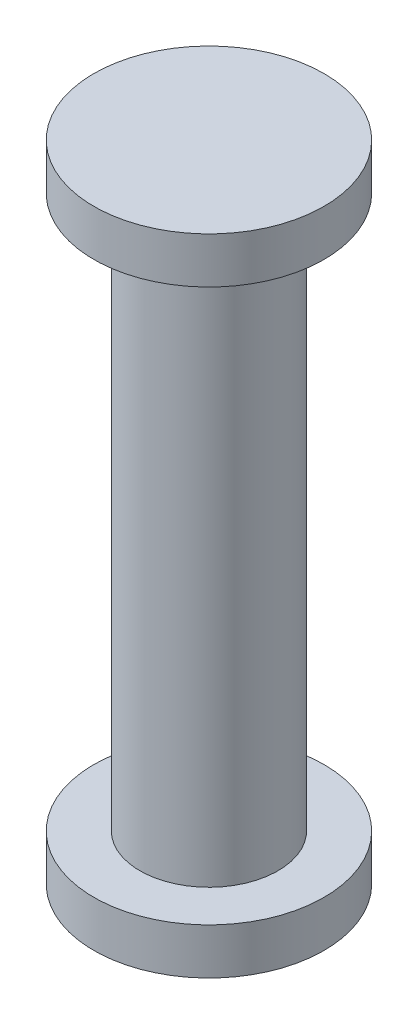
ISO-10303-21;
HEADER;
FILE_DESCRIPTION(('STEP AP214'),'2;1');
FILE_NAME('part.step','',(''),(''),'','','');
FILE_SCHEMA(('AUTOMOTIVE_DESIGN { 1 0 10303 214 1 1 1 1 }'));
ENDSEC;
DATA;
#1=APPLICATION_CONTEXT('core data for automotive mechanical design processes');
#2=APPLICATION_PROTOCOL_DEFINITION('international standard','automotive_design',2000,#1);
#3=PRODUCT_CONTEXT('',#1,'mechanical');
#4=PRODUCT('Part','Part','',(#3));
#5=PRODUCT_RELATED_PRODUCT_CATEGORY('part','',(#4));
#6=PRODUCT_DEFINITION_FORMATION('','',#4);
#7=PRODUCT_DEFINITION_CONTEXT('part definition',#1,'design');
#8=PRODUCT_DEFINITION('design','',#6,#7);
#9=PRODUCT_DEFINITION_SHAPE('','',#8);
#10=(LENGTH_UNIT() NAMED_UNIT(*) SI_UNIT(.MILLI.,.METRE.));
#11=(NAMED_UNIT(*) PLANE_ANGLE_UNIT() SI_UNIT($,.RADIAN.));
#12=(NAMED_UNIT(*) SI_UNIT($,.STERADIAN.) SOLID_ANGLE_UNIT());
#13=UNCERTAINTY_MEASURE_WITH_UNIT(LENGTH_MEASURE(1.E-05),#10,'distance_accuracy_value','');
#14=(GEOMETRIC_REPRESENTATION_CONTEXT(3) GLOBAL_UNCERTAINTY_ASSIGNED_CONTEXT((#13)) GLOBAL_UNIT_ASSIGNED_CONTEXT((#10,
#11,#12)) REPRESENTATION_CONTEXT('',''));
#15=CARTESIAN_POINT('',(0.,0.,0.));
#16=DIRECTION('',(0.,0.,1.));
#17=DIRECTION('',(1.,0.,0.));
#18=AXIS2_PLACEMENT_3D('',#15,#16,#17);
#19=CARTESIAN_POINT('',(3.78332402163125,-4.38970454977032,0.));
#20=DIRECTION('',(0.,1.,0.));
#21=DIRECTION('',(0.,0.,1.));
#22=AXIS2_PLACEMENT_3D('',#19,#20,#21);
#23=PLANE('',#22);
#24=CARTESIAN_POINT('',(6.28332402163125,-4.38970454977032,0.));
#25=DIRECTION('',(0.,-1.,0.));
#26=DIRECTION('',(0.,0.,-1.));
#27=AXIS2_PLACEMENT_3D('',#24,#25,#26);
#28=CIRCLE('',#27,2.5);
#29=CARTESIAN_POINT('',(6.28332402163125,-4.38970454977032,-2.5));
#30=VERTEX_POINT('',#29);
#31=EDGE_CURVE('E64',#30,#30,#28,.T.);
#32=ORIENTED_EDGE('',*,*,#31,.T.);
#33=EDGE_LOOP('',(#32));
#34=FACE_BOUND('',#33,.T.);
#35=ADVANCED_FACE('F37',(#34),#23,.F.);
#36=CARTESIAN_POINT('',(6.28332402163125,9.61029545022968,0.));
#37=DIRECTION('',(0.,-1.,0.));
#38=DIRECTION('',(0.,0.,-1.));
#39=AXIS2_PLACEMENT_3D('',#36,#37,#38);
#40=PLANE('',#39);
#41=CARTESIAN_POINT('',(6.28332402163125,9.61029545022968,0.));
#42=DIRECTION('',(0.,-1.,0.));
#43=DIRECTION('',(0.,0.,-1.));
#44=AXIS2_PLACEMENT_3D('',#41,#42,#43);
#45=CIRCLE('',#44,2.5);
#46=CARTESIAN_POINT('',(6.28332402163125,9.61029545022968,-2.5));
#47=VERTEX_POINT('',#46);
#48=EDGE_CURVE('E10',#47,#47,#45,.T.);
#49=ORIENTED_EDGE('',*,*,#48,.F.);
#50=EDGE_LOOP('',(#49));
#51=FACE_BOUND('',#50,.T.);
#52=ADVANCED_FACE('F95',(#51),#40,.F.);
#53=CARTESIAN_POINT('',(6.28332402163125,-4.38970454977032,0.));
#54=DIRECTION('',(0.,-1.,0.));
#55=DIRECTION('',(0.,0.,-1.));
#56=AXIS2_PLACEMENT_3D('',#53,#54,#55);
#57=CYLINDRICAL_SURFACE('',#56,2.5);
#58=CARTESIAN_POINT('',(6.28332402163125,8.61029545022968,0.));
#59=DIRECTION('',(0.,-1.,0.));
#60=DIRECTION('',(0.,0.,-1.));
#61=AXIS2_PLACEMENT_3D('',#58,#59,#60);
#62=CIRCLE('',#61,2.5);
#63=CARTESIAN_POINT('',(6.28332402163125,8.61029545022968,-2.5));
#64=VERTEX_POINT('',#63);
#65=EDGE_CURVE('E44',#64,#64,#62,.T.);
#66=ORIENTED_EDGE('',*,*,#65,.F.);
#67=EDGE_LOOP('',(#66));
#68=FACE_BOUND('',#67,.T.);
#69=ORIENTED_EDGE('',*,*,#48,.T.);
#70=EDGE_LOOP('',(#69));
#71=FACE_BOUND('',#70,.T.);
#72=ADVANCED_FACE('F90',(#68,#71),#57,.T.);
#73=CARTESIAN_POINT('',(3.78332402163125,8.61029545022968,0.));
#74=DIRECTION('',(0.,1.,0.));
#75=DIRECTION('',(0.,0.,1.));
#76=AXIS2_PLACEMENT_3D('',#73,#74,#75);
#77=PLANE('',#76);
#78=CARTESIAN_POINT('',(6.28332402163125,8.61029545022968,0.));
#79=DIRECTION('',(0.,-1.,0.));
#80=DIRECTION('',(0.,0.,-1.));
#81=AXIS2_PLACEMENT_3D('',#78,#79,#80);
#82=CIRCLE('',#81,1.5);
#83=CARTESIAN_POINT('',(6.28332402163125,8.61029545022968,-1.5));
#84=VERTEX_POINT('',#83);
#85=EDGE_CURVE('E49',#84,#84,#82,.T.);
#86=ORIENTED_EDGE('',*,*,#85,.F.);
#87=EDGE_LOOP('',(#86));
#88=FACE_BOUND('',#87,.T.);
#89=ORIENTED_EDGE('',*,*,#65,.T.);
#90=EDGE_LOOP('',(#89));
#91=FACE_BOUND('',#90,.T.);
#92=ADVANCED_FACE('F85',(#88,#91),#77,.F.);
#93=CARTESIAN_POINT('',(6.28332402163125,-4.38970454977032,0.));
#94=DIRECTION('',(0.,-1.,0.));
#95=DIRECTION('',(0.,0.,-1.));
#96=AXIS2_PLACEMENT_3D('',#93,#94,#95);
#97=CYLINDRICAL_SURFACE('',#96,1.5);
#98=CARTESIAN_POINT('',(6.28332402163125,-3.38970454977032,0.));
#99=DIRECTION('',(0.,-1.,0.));
#100=DIRECTION('',(0.,0.,-1.));
#101=AXIS2_PLACEMENT_3D('',#98,#99,#100);
#102=CIRCLE('',#101,1.5);
#103=CARTESIAN_POINT('',(6.28332402163125,-3.38970454977032,-1.5));
#104=VERTEX_POINT('',#103);
#105=EDGE_CURVE('E54',#104,#104,#102,.T.);
#106=ORIENTED_EDGE('',*,*,#105,.F.);
#107=EDGE_LOOP('',(#106));
#108=FACE_BOUND('',#107,.T.);
#109=ORIENTED_EDGE('',*,*,#85,.T.);
#110=EDGE_LOOP('',(#109));
#111=FACE_BOUND('',#110,.T.);
#112=ADVANCED_FACE('F79',(#108,#111),#97,.T.);
#113=CARTESIAN_POINT('',(4.78332402163125,-3.38970454977032,0.));
#114=DIRECTION('',(0.,-1.,0.));
#115=DIRECTION('',(0.,0.,-1.));
#116=AXIS2_PLACEMENT_3D('',#113,#114,#115);
#117=PLANE('',#116);
#118=CARTESIAN_POINT('',(6.28332402163125,-3.38970454977032,0.));
#119=DIRECTION('',(0.,-1.,0.));
#120=DIRECTION('',(0.,0.,-1.));
#121=AXIS2_PLACEMENT_3D('',#118,#119,#120);
#122=CIRCLE('',#121,2.5);
#123=CARTESIAN_POINT('',(6.28332402163125,-3.38970454977032,-2.5));
#124=VERTEX_POINT('',#123);
#125=EDGE_CURVE('E60',#124,#124,#122,.T.);
#126=ORIENTED_EDGE('',*,*,#125,.F.);
#127=EDGE_LOOP('',(#126));
#128=FACE_BOUND('',#127,.T.);
#129=ORIENTED_EDGE('',*,*,#105,.T.);
#130=EDGE_LOOP('',(#129));
#131=FACE_BOUND('',#130,.T.);
#132=ADVANCED_FACE('F73',(#128,#131),#117,.F.);
#133=CARTESIAN_POINT('',(6.28332402163125,-4.38970454977032,0.));
#134=DIRECTION('',(0.,-1.,0.));
#135=DIRECTION('',(0.,0.,-1.));
#136=AXIS2_PLACEMENT_3D('',#133,#134,#135);
#137=CYLINDRICAL_SURFACE('',#136,2.5);
#138=ORIENTED_EDGE('',*,*,#31,.F.);
#139=EDGE_LOOP('',(#138));
#140=FACE_BOUND('',#139,.T.);
#141=ORIENTED_EDGE('',*,*,#125,.T.);
#142=EDGE_LOOP('',(#141));
#143=FACE_BOUND('',#142,.T.);
#144=ADVANCED_FACE('F70',(#140,#143),#137,.T.);
#145=CLOSED_SHELL('',(#35,#52,#72,#92,#112,#132,#144));
#146=MANIFOLD_SOLID_BREP('B2',#145);
#147=ADVANCED_BREP_SHAPE_REPRESENTATION('',(#18,#146),#14);
#148=SHAPE_DEFINITION_REPRESENTATION(#9,#147);
ENDSEC;
END-ISO-10303-21;
